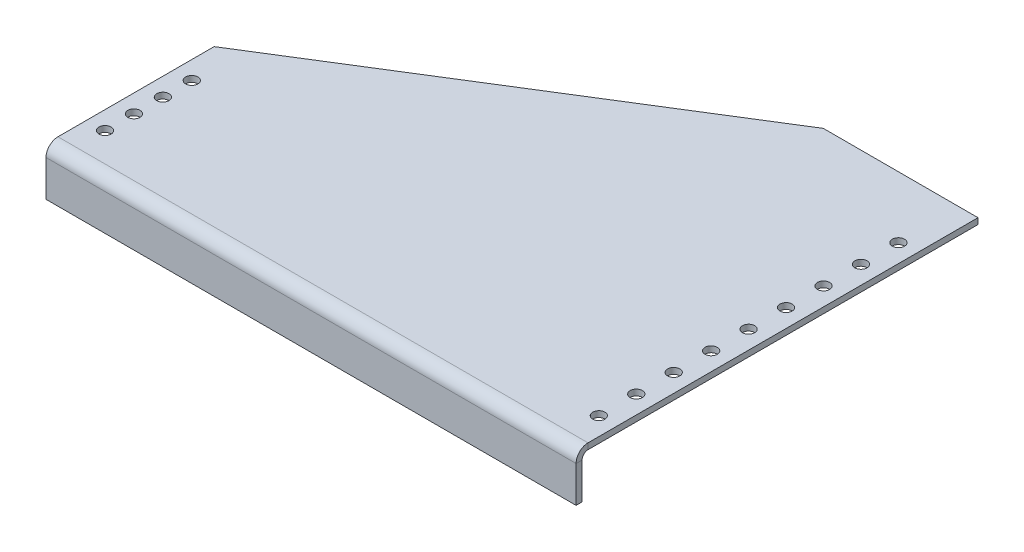
ISO-10303-21;
HEADER;
FILE_DESCRIPTION(('STEP AP214'),'2;1');
FILE_NAME('part.step','',(''),(''),'','','');
FILE_SCHEMA(('AUTOMOTIVE_DESIGN { 1 0 10303 214 1 1 1 1 }'));
ENDSEC;
DATA;
#1=APPLICATION_CONTEXT('core data for automotive mechanical design processes');
#2=APPLICATION_PROTOCOL_DEFINITION('international standard','automotive_design',2000,#1);
#3=PRODUCT_CONTEXT('',#1,'mechanical');
#4=PRODUCT('Part','Part','',(#3));
#5=PRODUCT_RELATED_PRODUCT_CATEGORY('part','',(#4));
#6=PRODUCT_DEFINITION_FORMATION('','',#4);
#7=PRODUCT_DEFINITION_CONTEXT('part definition',#1,'design');
#8=PRODUCT_DEFINITION('design','',#6,#7);
#9=PRODUCT_DEFINITION_SHAPE('','',#8);
#10=(LENGTH_UNIT() NAMED_UNIT(*) SI_UNIT(.MILLI.,.METRE.));
#11=(NAMED_UNIT(*) PLANE_ANGLE_UNIT() SI_UNIT($,.RADIAN.));
#12=(NAMED_UNIT(*) SI_UNIT($,.STERADIAN.) SOLID_ANGLE_UNIT());
#13=UNCERTAINTY_MEASURE_WITH_UNIT(LENGTH_MEASURE(1.E-05),#10,'distance_accuracy_value','');
#14=(GEOMETRIC_REPRESENTATION_CONTEXT(3) GLOBAL_UNCERTAINTY_ASSIGNED_CONTEXT((#13)) GLOBAL_UNIT_ASSIGNED_CONTEXT((#10,
#11,#12)) REPRESENTATION_CONTEXT('',''));
#15=CARTESIAN_POINT('',(0.,0.,0.));
#16=DIRECTION('',(0.,0.,1.));
#17=DIRECTION('',(1.,0.,0.));
#18=AXIS2_PLACEMENT_3D('',#15,#16,#17);
#19=CARTESIAN_POINT('',(-89.3979999999895,-2.3622,87.757));
#20=DIRECTION('',(-1.,0.,0.));
#21=DIRECTION('',(0.,0.,1.));
#22=AXIS2_PLACEMENT_3D('',#19,#20,#21);
#23=PLANE('',#22);
#24=DIRECTION('',(0.,1.,0.));
#25=VECTOR('',#24,1.);
#26=CARTESIAN_POINT('',(-89.3979999999895,-2.3622,23.6781659251188));
#27=LINE('',#26,#25);
#28=CARTESIAN_POINT('',(-89.3979999999895,-2.3622,23.6781659251188));
#29=VERTEX_POINT('',#28);
#30=CARTESIAN_POINT('',(-89.3979999999895,0.,23.6781659251188));
#31=VERTEX_POINT('',#30);
#32=EDGE_CURVE('E118',#29,#31,#27,.T.);
#33=ORIENTED_EDGE('',*,*,#32,.F.);
#34=DIRECTION('',(0.,0.,1.));
#35=VECTOR('',#34,1.);
#36=CARTESIAN_POINT('',(-89.3979999999895,-2.3622,87.757));
#37=LINE('',#36,#35);
#38=CARTESIAN_POINT('',(-89.3979999999894,-2.36219999999999,85.397));
#39=VERTEX_POINT('',#38);
#40=EDGE_CURVE('E192',#29,#39,#37,.T.);
#41=ORIENTED_EDGE('',*,*,#40,.T.);
#42=DIRECTION('',(0.,1.,0.));
#43=VECTOR('',#42,1.);
#44=CARTESIAN_POINT('',(-89.3979999999894,-2.36219999999999,85.397));
#45=LINE('',#44,#43);
#46=CARTESIAN_POINT('',(-89.3979999999894,0.,85.397));
#47=VERTEX_POINT('',#46);
#48=EDGE_CURVE('E177',#39,#47,#45,.T.);
#49=ORIENTED_EDGE('',*,*,#48,.T.);
#50=DIRECTION('',(0.,0.,1.));
#51=VECTOR('',#50,1.);
#52=CARTESIAN_POINT('',(-89.3979999999895,0.,87.757));
#53=LINE('',#52,#51);
#54=EDGE_CURVE('E189',#31,#47,#53,.T.);
#55=ORIENTED_EDGE('',*,*,#54,.F.);
#56=EDGE_LOOP('',(#33,#41,#49,#55));
#57=FACE_BOUND('',#56,.T.);
#58=ADVANCED_FACE('F43',(#57),#23,.T.);
#59=CARTESIAN_POINT('',(0.,-2.3622,0.));
#60=DIRECTION('',(0.,1.,0.));
#61=DIRECTION('',(0.,0.,1.));
#62=AXIS2_PLACEMENT_3D('',#59,#60,#61);
#63=PLANE('',#62);
#64=CARTESIAN_POINT('',(112.914100000012,-2.3622,73.9669999999571));
#65=DIRECTION('',(0.,-1.,0.));
#66=DIRECTION('',(0.,0.,-1.));
#67=AXIS2_PLACEMENT_3D('',#64,#65,#66);
#68=CIRCLE('',#67,2.41299999999999);
#69=CARTESIAN_POINT('',(112.914100000012,-2.3622,71.5539999999571));
#70=VERTEX_POINT('',#69);
#71=EDGE_CURVE('E325',#70,#70,#68,.T.);
#72=ORIENTED_EDGE('',*,*,#71,.F.);
#73=EDGE_LOOP('',(#72));
#74=FACE_BOUND('',#73,.T.);
#75=CARTESIAN_POINT('',(112.914100000012,-2.3622,59.1689106376127));
#76=DIRECTION('',(0.,-1.,0.));
#77=DIRECTION('',(0.,0.,-1.));
#78=AXIS2_PLACEMENT_3D('',#75,#76,#77);
#79=CIRCLE('',#78,2.41300000000001);
#80=CARTESIAN_POINT('',(112.914100000012,-2.3622,56.7559106376127));
#81=VERTEX_POINT('',#80);
#82=EDGE_CURVE('E326',#81,#81,#79,.T.);
#83=ORIENTED_EDGE('',*,*,#82,.F.);
#84=EDGE_LOOP('',(#83));
#85=FACE_BOUND('',#84,.T.);
#86=CARTESIAN_POINT('',(112.914100000012,-2.3622,44.3708212752683));
#87=DIRECTION('',(0.,-1.,0.));
#88=DIRECTION('',(0.,0.,-1.));
#89=AXIS2_PLACEMENT_3D('',#86,#87,#88);
#90=CIRCLE('',#89,2.41299999999999);
#91=CARTESIAN_POINT('',(112.914100000012,-2.3622,41.9578212752683));
#92=VERTEX_POINT('',#91);
#93=EDGE_CURVE('E335',#92,#92,#90,.T.);
#94=ORIENTED_EDGE('',*,*,#93,.F.);
#95=EDGE_LOOP('',(#94));
#96=FACE_BOUND('',#95,.T.);
#97=CARTESIAN_POINT('',(112.914100000012,-2.3622,29.5727319129239));
#98=DIRECTION('',(0.,-1.,0.));
#99=DIRECTION('',(0.,0.,-1.));
#100=AXIS2_PLACEMENT_3D('',#97,#98,#99);
#101=CIRCLE('',#100,2.413);
#102=CARTESIAN_POINT('',(112.914100000012,-2.3622,27.1597319129239));
#103=VERTEX_POINT('',#102);
#104=EDGE_CURVE('E341',#103,#103,#101,.T.);
#105=ORIENTED_EDGE('',*,*,#104,.F.);
#106=EDGE_LOOP('',(#105));
#107=FACE_BOUND('',#106,.T.);
#108=CARTESIAN_POINT('',(112.914100000012,-2.3622,14.7746425505795));
#109=DIRECTION('',(0.,-1.,0.));
#110=DIRECTION('',(0.,0.,-1.));
#111=AXIS2_PLACEMENT_3D('',#108,#109,#110);
#112=CIRCLE('',#111,2.41300000000001);
#113=CARTESIAN_POINT('',(112.914100000012,-2.3622,12.3616425505795));
#114=VERTEX_POINT('',#113);
#115=EDGE_CURVE('E347',#114,#114,#112,.T.);
#116=ORIENTED_EDGE('',*,*,#115,.F.);
#117=EDGE_LOOP('',(#116));
#118=FACE_BOUND('',#117,.T.);
#119=CARTESIAN_POINT('',(112.914100000012,-2.3622,-0.023446811764952));
#120=DIRECTION('',(0.,-1.,0.));
#121=DIRECTION('',(0.,0.,-1.));
#122=AXIS2_PLACEMENT_3D('',#119,#120,#121);
#123=CIRCLE('',#122,2.41299999999999);
#124=CARTESIAN_POINT('',(112.914100000012,-2.3622,-2.43644681176495));
#125=VERTEX_POINT('',#124);
#126=EDGE_CURVE('E353',#125,#125,#123,.T.);
#127=ORIENTED_EDGE('',*,*,#126,.F.);
#128=EDGE_LOOP('',(#127));
#129=FACE_BOUND('',#128,.T.);
#130=CARTESIAN_POINT('',(112.914100000012,-2.3622,-14.8215361741094));
#131=DIRECTION('',(0.,-1.,0.));
#132=DIRECTION('',(0.,0.,-1.));
#133=AXIS2_PLACEMENT_3D('',#130,#131,#132);
#134=CIRCLE('',#133,2.41300000000001);
#135=CARTESIAN_POINT('',(112.914100000012,-2.3622,-17.2345361741094));
#136=VERTEX_POINT('',#135);
#137=EDGE_CURVE('E359',#136,#136,#134,.T.);
#138=ORIENTED_EDGE('',*,*,#137,.F.);
#139=EDGE_LOOP('',(#138));
#140=FACE_BOUND('',#139,.T.);
#141=CARTESIAN_POINT('',(112.914100000012,-2.3622,-29.6196255364538));
#142=DIRECTION('',(0.,-1.,0.));
#143=DIRECTION('',(0.,0.,-1.));
#144=AXIS2_PLACEMENT_3D('',#141,#142,#143);
#145=CIRCLE('',#144,2.413);
#146=CARTESIAN_POINT('',(112.914100000012,-2.3622,-32.0326255364538));
#147=VERTEX_POINT('',#146);
#148=EDGE_CURVE('E365',#147,#147,#145,.T.);
#149=ORIENTED_EDGE('',*,*,#148,.F.);
#150=EDGE_LOOP('',(#149));
#151=FACE_BOUND('',#150,.T.);
#152=CARTESIAN_POINT('',(112.914100000012,-2.3622,-44.4177148987982));
#153=DIRECTION('',(0.,-1.,0.));
#154=DIRECTION('',(0.,0.,-1.));
#155=AXIS2_PLACEMENT_3D('',#152,#153,#154);
#156=CIRCLE('',#155,2.41299999999999);
#157=CARTESIAN_POINT('',(112.914100000012,-2.3622,-46.8307148987982));
#158=VERTEX_POINT('',#157);
#159=EDGE_CURVE('E371',#158,#158,#156,.T.);
#160=ORIENTED_EDGE('',*,*,#159,.F.);
#161=EDGE_LOOP('',(#160));
#162=FACE_BOUND('',#161,.T.);
#163=CARTESIAN_POINT('',(-82.2340999999855,-2.3622,73.9669999999578));
#164=DIRECTION('',(0.,-1.,0.));
#165=DIRECTION('',(0.,0.,-1.));
#166=AXIS2_PLACEMENT_3D('',#163,#164,#165);
#167=CIRCLE('',#166,2.41299999999999);
#168=CARTESIAN_POINT('',(-82.2340999999855,-2.3622,71.5539999999579));
#169=VERTEX_POINT('',#168);
#170=EDGE_CURVE('E379',#169,#169,#167,.T.);
#171=ORIENTED_EDGE('',*,*,#170,.F.);
#172=EDGE_LOOP('',(#171));
#173=FACE_BOUND('',#172,.T.);
#174=CARTESIAN_POINT('',(-82.2340999999855,-2.3622,62.5369999999578));
#175=DIRECTION('',(0.,-1.,0.));
#176=DIRECTION('',(0.,0.,-1.));
#177=AXIS2_PLACEMENT_3D('',#174,#175,#176);
#178=CIRCLE('',#177,2.41299999999999);
#179=CARTESIAN_POINT('',(-82.2340999999855,-2.3622,60.1239999999579));
#180=VERTEX_POINT('',#179);
#181=EDGE_CURVE('E382',#180,#180,#178,.T.);
#182=ORIENTED_EDGE('',*,*,#181,.F.);
#183=EDGE_LOOP('',(#182));
#184=FACE_BOUND('',#183,.T.);
#185=CARTESIAN_POINT('',(-82.2340999999856,-2.3622,51.1069999999578));
#186=DIRECTION('',(0.,-1.,0.));
#187=DIRECTION('',(0.,0.,-1.));
#188=AXIS2_PLACEMENT_3D('',#185,#186,#187);
#189=CIRCLE('',#188,2.41300000000001);
#190=CARTESIAN_POINT('',(-82.2340999999856,-2.3622,48.6939999999578));
#191=VERTEX_POINT('',#190);
#192=EDGE_CURVE('E388',#191,#191,#189,.T.);
#193=ORIENTED_EDGE('',*,*,#192,.F.);
#194=EDGE_LOOP('',(#193));
#195=FACE_BOUND('',#194,.T.);
#196=CARTESIAN_POINT('',(-82.2340999999856,-2.3622,39.6769999999579));
#197=DIRECTION('',(0.,-1.,0.));
#198=DIRECTION('',(0.,0.,-1.));
#199=AXIS2_PLACEMENT_3D('',#196,#197,#198);
#200=CIRCLE('',#199,2.41299999999999);
#201=CARTESIAN_POINT('',(-82.2340999999856,-2.3622,37.2639999999579));
#202=VERTEX_POINT('',#201);
#203=EDGE_CURVE('E393',#202,#202,#200,.T.);
#204=ORIENTED_EDGE('',*,*,#203,.F.);
#205=EDGE_LOOP('',(#204));
#206=FACE_BOUND('',#205,.T.);
#207=ORIENTED_EDGE('',*,*,#40,.F.);
#208=DIRECTION('',(-0.848832674791451,0.,0.528661602735049));
#209=VECTOR('',#208,1.);
#210=CARTESIAN_POINT('',(-94.1201999999872,-2.3622,26.6192000000001));
#211=LINE('',#210,#209);
#212=CARTESIAN_POINT('',(58.9380000000124,-2.3622,-68.7070000000431));
#213=VERTEX_POINT('',#212);
#214=EDGE_CURVE('E132',#213,#29,#211,.T.);
#215=ORIENTED_EDGE('',*,*,#214,.F.);
#216=DIRECTION('',(-1.,0.,0.));
#217=VECTOR('',#216,1.);
#218=CARTESIAN_POINT('',(58.9380000000124,-2.3622,-68.7070000000431));
#219=LINE('',#218,#217);
#220=CARTESIAN_POINT('',(120.078000000012,-2.3622,-68.7070000000431));
#221=VERTEX_POINT('',#220);
#222=EDGE_CURVE('E115',#221,#213,#219,.T.);
#223=ORIENTED_EDGE('',*,*,#222,.F.);
#224=DIRECTION('',(0.,0.,-1.));
#225=VECTOR('',#224,1.);
#226=CARTESIAN_POINT('',(120.078000000012,-2.3622,87.757));
#227=LINE('',#226,#225);
#228=CARTESIAN_POINT('',(120.078000000012,-2.36219999999999,85.397));
#229=VERTEX_POINT('',#228);
#230=EDGE_CURVE('E50',#229,#221,#227,.T.);
#231=ORIENTED_EDGE('',*,*,#230,.F.);
#232=DIRECTION('',(-1.,0.,0.));
#233=VECTOR('',#232,1.);
#234=CARTESIAN_POINT('',(-89.3979999999894,-2.36219999999999,85.397));
#235=LINE('',#234,#233);
#236=EDGE_CURVE('E183',#39,#229,#235,.F.);
#237=ORIENTED_EDGE('',*,*,#236,.F.);
#238=EDGE_LOOP('',(#207,#215,#223,#231,#237));
#239=FACE_BOUND('',#238,.T.);
#240=ADVANCED_FACE('F207',(#74,#85,#96,#107,#118,#129,#140,#151,#162,#173,#184,#195,#206,#239),
#63,.F.);
#241=CARTESIAN_POINT('',(0.,0.,0.));
#242=DIRECTION('',(0.,1.,0.));
#243=DIRECTION('',(0.,0.,1.));
#244=AXIS2_PLACEMENT_3D('',#241,#242,#243);
#245=PLANE('',#244);
#246=CARTESIAN_POINT('',(112.914100000012,0.,73.9669999999571));
#247=DIRECTION('',(0.,-1.,0.));
#248=DIRECTION('',(0.,0.,-1.));
#249=AXIS2_PLACEMENT_3D('',#246,#247,#248);
#250=CIRCLE('',#249,2.41299999999999);
#251=CARTESIAN_POINT('',(112.914100000012,0.,71.5539999999571));
#252=VERTEX_POINT('',#251);
#253=EDGE_CURVE('E323',#252,#252,#250,.T.);
#254=ORIENTED_EDGE('',*,*,#253,.T.);
#255=EDGE_LOOP('',(#254));
#256=FACE_BOUND('',#255,.T.);
#257=CARTESIAN_POINT('',(112.914100000012,0.,59.1689106376127));
#258=DIRECTION('',(0.,-1.,0.));
#259=DIRECTION('',(0.,0.,-1.));
#260=AXIS2_PLACEMENT_3D('',#257,#258,#259);
#261=CIRCLE('',#260,2.41300000000001);
#262=CARTESIAN_POINT('',(112.914100000012,0.,56.7559106376127));
#263=VERTEX_POINT('',#262);
#264=EDGE_CURVE('E330',#263,#263,#261,.T.);
#265=ORIENTED_EDGE('',*,*,#264,.T.);
#266=EDGE_LOOP('',(#265));
#267=FACE_BOUND('',#266,.T.);
#268=CARTESIAN_POINT('',(112.914100000012,0.,44.3708212752683));
#269=DIRECTION('',(0.,-1.,0.));
#270=DIRECTION('',(0.,0.,-1.));
#271=AXIS2_PLACEMENT_3D('',#268,#269,#270);
#272=CIRCLE('',#271,2.41299999999999);
#273=CARTESIAN_POINT('',(112.914100000012,0.,41.9578212752683));
#274=VERTEX_POINT('',#273);
#275=EDGE_CURVE('E338',#274,#274,#272,.T.);
#276=ORIENTED_EDGE('',*,*,#275,.T.);
#277=EDGE_LOOP('',(#276));
#278=FACE_BOUND('',#277,.T.);
#279=CARTESIAN_POINT('',(112.914100000012,0.,29.5727319129239));
#280=DIRECTION('',(0.,-1.,0.));
#281=DIRECTION('',(0.,0.,-1.));
#282=AXIS2_PLACEMENT_3D('',#279,#280,#281);
#283=CIRCLE('',#282,2.413);
#284=CARTESIAN_POINT('',(112.914100000012,0.,27.1597319129239));
#285=VERTEX_POINT('',#284);
#286=EDGE_CURVE('E344',#285,#285,#283,.T.);
#287=ORIENTED_EDGE('',*,*,#286,.T.);
#288=EDGE_LOOP('',(#287));
#289=FACE_BOUND('',#288,.T.);
#290=CARTESIAN_POINT('',(112.914100000012,0.,14.7746425505795));
#291=DIRECTION('',(0.,-1.,0.));
#292=DIRECTION('',(0.,0.,-1.));
#293=AXIS2_PLACEMENT_3D('',#290,#291,#292);
#294=CIRCLE('',#293,2.41300000000001);
#295=CARTESIAN_POINT('',(112.914100000012,0.,12.3616425505795));
#296=VERTEX_POINT('',#295);
#297=EDGE_CURVE('E350',#296,#296,#294,.T.);
#298=ORIENTED_EDGE('',*,*,#297,.T.);
#299=EDGE_LOOP('',(#298));
#300=FACE_BOUND('',#299,.T.);
#301=CARTESIAN_POINT('',(112.914100000012,0.,-0.023446811764952));
#302=DIRECTION('',(0.,-1.,0.));
#303=DIRECTION('',(0.,0.,-1.));
#304=AXIS2_PLACEMENT_3D('',#301,#302,#303);
#305=CIRCLE('',#304,2.41299999999999);
#306=CARTESIAN_POINT('',(112.914100000012,0.,-2.43644681176495));
#307=VERTEX_POINT('',#306);
#308=EDGE_CURVE('E356',#307,#307,#305,.T.);
#309=ORIENTED_EDGE('',*,*,#308,.T.);
#310=EDGE_LOOP('',(#309));
#311=FACE_BOUND('',#310,.T.);
#312=CARTESIAN_POINT('',(112.914100000012,0.,-14.8215361741094));
#313=DIRECTION('',(0.,-1.,0.));
#314=DIRECTION('',(0.,0.,-1.));
#315=AXIS2_PLACEMENT_3D('',#312,#313,#314);
#316=CIRCLE('',#315,2.41300000000001);
#317=CARTESIAN_POINT('',(112.914100000012,0.,-17.2345361741094));
#318=VERTEX_POINT('',#317);
#319=EDGE_CURVE('E362',#318,#318,#316,.T.);
#320=ORIENTED_EDGE('',*,*,#319,.T.);
#321=EDGE_LOOP('',(#320));
#322=FACE_BOUND('',#321,.T.);
#323=CARTESIAN_POINT('',(112.914100000012,0.,-29.6196255364538));
#324=DIRECTION('',(0.,-1.,0.));
#325=DIRECTION('',(0.,0.,-1.));
#326=AXIS2_PLACEMENT_3D('',#323,#324,#325);
#327=CIRCLE('',#326,2.413);
#328=CARTESIAN_POINT('',(112.914100000012,0.,-32.0326255364538));
#329=VERTEX_POINT('',#328);
#330=EDGE_CURVE('E368',#329,#329,#327,.T.);
#331=ORIENTED_EDGE('',*,*,#330,.T.);
#332=EDGE_LOOP('',(#331));
#333=FACE_BOUND('',#332,.T.);
#334=CARTESIAN_POINT('',(112.914100000012,0.,-44.4177148987982));
#335=DIRECTION('',(0.,-1.,0.));
#336=DIRECTION('',(0.,0.,-1.));
#337=AXIS2_PLACEMENT_3D('',#334,#335,#336);
#338=CIRCLE('',#337,2.41299999999999);
#339=CARTESIAN_POINT('',(112.914100000012,0.,-46.8307148987982));
#340=VERTEX_POINT('',#339);
#341=EDGE_CURVE('E374',#340,#340,#338,.T.);
#342=ORIENTED_EDGE('',*,*,#341,.T.);
#343=EDGE_LOOP('',(#342));
#344=FACE_BOUND('',#343,.T.);
#345=CARTESIAN_POINT('',(-82.2340999999855,0.,73.9669999999578));
#346=DIRECTION('',(0.,-1.,0.));
#347=DIRECTION('',(0.,0.,-1.));
#348=AXIS2_PLACEMENT_3D('',#345,#346,#347);
#349=CIRCLE('',#348,2.41299999999999);
#350=CARTESIAN_POINT('',(-82.2340999999855,0.,71.5539999999579));
#351=VERTEX_POINT('',#350);
#352=EDGE_CURVE('E139',#351,#351,#349,.T.);
#353=ORIENTED_EDGE('',*,*,#352,.T.);
#354=EDGE_LOOP('',(#353));
#355=FACE_BOUND('',#354,.T.);
#356=CARTESIAN_POINT('',(-82.2340999999855,0.,62.5369999999578));
#357=DIRECTION('',(0.,-1.,0.));
#358=DIRECTION('',(0.,0.,-1.));
#359=AXIS2_PLACEMENT_3D('',#356,#357,#358);
#360=CIRCLE('',#359,2.41299999999999);
#361=CARTESIAN_POINT('',(-82.2340999999855,0.,60.1239999999579));
#362=VERTEX_POINT('',#361);
#363=EDGE_CURVE('E385',#362,#362,#360,.T.);
#364=ORIENTED_EDGE('',*,*,#363,.T.);
#365=EDGE_LOOP('',(#364));
#366=FACE_BOUND('',#365,.T.);
#367=CARTESIAN_POINT('',(-82.2340999999856,0.,51.1069999999578));
#368=DIRECTION('',(0.,-1.,0.));
#369=DIRECTION('',(0.,0.,-1.));
#370=AXIS2_PLACEMENT_3D('',#367,#368,#369);
#371=CIRCLE('',#370,2.41300000000001);
#372=CARTESIAN_POINT('',(-82.2340999999856,0.,48.6939999999578));
#373=VERTEX_POINT('',#372);
#374=EDGE_CURVE('E391',#373,#373,#371,.T.);
#375=ORIENTED_EDGE('',*,*,#374,.T.);
#376=EDGE_LOOP('',(#375));
#377=FACE_BOUND('',#376,.T.);
#378=CARTESIAN_POINT('',(-82.2340999999856,0.,39.6769999999579));
#379=DIRECTION('',(0.,-1.,0.));
#380=DIRECTION('',(0.,0.,-1.));
#381=AXIS2_PLACEMENT_3D('',#378,#379,#380);
#382=CIRCLE('',#381,2.41299999999999);
#383=CARTESIAN_POINT('',(-82.2340999999856,0.,37.2639999999579));
#384=VERTEX_POINT('',#383);
#385=EDGE_CURVE('E136',#384,#384,#382,.T.);
#386=ORIENTED_EDGE('',*,*,#385,.T.);
#387=EDGE_LOOP('',(#386));
#388=FACE_BOUND('',#387,.T.);
#389=DIRECTION('',(-0.848832674791451,0.,0.528661602735049));
#390=VECTOR('',#389,1.);
#391=CARTESIAN_POINT('',(-94.1201999999872,0.,26.6192000000001));
#392=LINE('',#391,#390);
#393=CARTESIAN_POINT('',(58.9380000000124,0.,-68.7070000000431));
#394=VERTEX_POINT('',#393);
#395=EDGE_CURVE('E119',#394,#31,#392,.T.);
#396=ORIENTED_EDGE('',*,*,#395,.T.);
#397=ORIENTED_EDGE('',*,*,#54,.T.);
#398=DIRECTION('',(-1.,0.,0.));
#399=VECTOR('',#398,1.);
#400=CARTESIAN_POINT('',(-89.3979999999894,0.,85.397));
#401=LINE('',#400,#399);
#402=CARTESIAN_POINT('',(120.078000000012,0.,85.397));
#403=VERTEX_POINT('',#402);
#404=EDGE_CURVE('E173',#47,#403,#401,.F.);
#405=ORIENTED_EDGE('',*,*,#404,.T.);
#406=DIRECTION('',(0.,0.,-1.));
#407=VECTOR('',#406,1.);
#408=CARTESIAN_POINT('',(120.078000000012,0.,87.757));
#409=LINE('',#408,#407);
#410=CARTESIAN_POINT('',(120.078000000012,0.,-68.7070000000431));
#411=VERTEX_POINT('',#410);
#412=EDGE_CURVE('E131',#403,#411,#409,.T.);
#413=ORIENTED_EDGE('',*,*,#412,.T.);
#414=DIRECTION('',(-1.,0.,0.));
#415=VECTOR('',#414,1.);
#416=CARTESIAN_POINT('',(58.9380000000124,0.,-68.7070000000431));
#417=LINE('',#416,#415);
#418=EDGE_CURVE('E56',#411,#394,#417,.T.);
#419=ORIENTED_EDGE('',*,*,#418,.T.);
#420=EDGE_LOOP('',(#396,#397,#405,#413,#419));
#421=FACE_BOUND('',#420,.T.);
#422=ADVANCED_FACE('F128',(#256,#267,#278,#289,#300,#311,#322,#333,#344,#355,#366,#377,#388,
#421),#245,.T.);
#423=CARTESIAN_POINT('',(120.078000000012,-2.3622,87.757));
#424=DIRECTION('',(1.,0.,0.));
#425=DIRECTION('',(0.,0.,-1.));
#426=AXIS2_PLACEMENT_3D('',#423,#424,#425);
#427=PLANE('',#426);
#428=DIRECTION('',(0.,-1.,0.));
#429=VECTOR('',#428,1.);
#430=CARTESIAN_POINT('',(120.078000000012,-2.3622,-68.7070000000431));
#431=LINE('',#430,#429);
#432=EDGE_CURVE('E11',#411,#221,#431,.T.);
#433=ORIENTED_EDGE('',*,*,#432,.F.);
#434=ORIENTED_EDGE('',*,*,#412,.F.);
#435=DIRECTION('',(0.,1.,0.));
#436=VECTOR('',#435,1.);
#437=CARTESIAN_POINT('',(120.078000000012,-2.36219999999999,85.397));
#438=LINE('',#437,#436);
#439=EDGE_CURVE('E187',#229,#403,#438,.T.);
#440=ORIENTED_EDGE('',*,*,#439,.F.);
#441=ORIENTED_EDGE('',*,*,#230,.T.);
#442=EDGE_LOOP('',(#433,#434,#440,#441));
#443=FACE_BOUND('',#442,.T.);
#444=ADVANCED_FACE('F217',(#443),#427,.T.);
#445=CARTESIAN_POINT('',(120.078000000012,-4.72219999999998,85.397));
#446=DIRECTION('',(1.,0.,0.));
#447=DIRECTION('',(0.,0.,-1.));
#448=AXIS2_PLACEMENT_3D('',#445,#446,#447);
#449=PLANE('',#448);
#450=DIRECTION('',(0.,0.,1.));
#451=VECTOR('',#450,1.);
#452=CARTESIAN_POINT('',(120.078000000012,-4.72219999999998,87.757));
#453=LINE('',#452,#451);
#454=CARTESIAN_POINT('',(120.078000000012,-4.72219999999997,87.757));
#455=VERTEX_POINT('',#454);
#456=CARTESIAN_POINT('',(120.078000000012,-4.72219999999997,90.1192));
#457=VERTEX_POINT('',#456);
#458=EDGE_CURVE('E142',#455,#457,#453,.T.);
#459=ORIENTED_EDGE('',*,*,#458,.F.);
#460=CARTESIAN_POINT('',(120.078000000012,-4.72219999999998,85.397));
#461=DIRECTION('',(-1.,0.,0.));
#462=DIRECTION('',(0.,0.,1.));
#463=AXIS2_PLACEMENT_3D('',#460,#461,#462);
#464=CIRCLE('',#463,2.35999999999999);
#465=EDGE_CURVE('E180',#229,#455,#464,.F.);
#466=ORIENTED_EDGE('',*,*,#465,.F.);
#467=ORIENTED_EDGE('',*,*,#439,.T.);
#468=CARTESIAN_POINT('',(120.078000000012,-4.72219999999998,85.397));
#469=DIRECTION('',(-1.,0.,0.));
#470=DIRECTION('',(0.,0.,1.));
#471=AXIS2_PLACEMENT_3D('',#468,#469,#470);
#472=CIRCLE('',#471,4.72219999999999);
#473=EDGE_CURVE('E64',#403,#457,#472,.F.);
#474=ORIENTED_EDGE('',*,*,#473,.T.);
#475=EDGE_LOOP('',(#459,#466,#467,#474));
#476=FACE_BOUND('',#475,.T.);
#477=ADVANCED_FACE('F215',(#476),#449,.T.);
#478=CARTESIAN_POINT('',(-89.3979999999894,-4.72219999999998,85.397));
#479=DIRECTION('',(1.,0.,0.));
#480=DIRECTION('',(0.,0.,-1.));
#481=AXIS2_PLACEMENT_3D('',#478,#479,#480);
#482=PLANE('',#481);
#483=CARTESIAN_POINT('',(-89.3979999999894,-4.72219999999998,85.397));
#484=DIRECTION('',(-1.,0.,0.));
#485=DIRECTION('',(0.,0.,1.));
#486=AXIS2_PLACEMENT_3D('',#483,#484,#485);
#487=CIRCLE('',#486,2.35999999999999);
#488=CARTESIAN_POINT('',(-89.3979999999894,-4.72219999999997,87.757));
#489=VERTEX_POINT('',#488);
#490=EDGE_CURVE('E172',#489,#39,#487,.T.);
#491=ORIENTED_EDGE('',*,*,#490,.F.);
#492=DIRECTION('',(0.,0.,1.));
#493=VECTOR('',#492,1.);
#494=CARTESIAN_POINT('',(-89.3979999999894,-4.72219999999998,87.757));
#495=LINE('',#494,#493);
#496=CARTESIAN_POINT('',(-89.3979999999894,-4.72219999999998,90.1192));
#497=VERTEX_POINT('',#496);
#498=EDGE_CURVE('E145',#489,#497,#495,.T.);
#499=ORIENTED_EDGE('',*,*,#498,.T.);
#500=CARTESIAN_POINT('',(-89.3979999999894,-4.72219999999998,85.397));
#501=DIRECTION('',(-1.,0.,0.));
#502=DIRECTION('',(0.,0.,1.));
#503=AXIS2_PLACEMENT_3D('',#500,#501,#502);
#504=CIRCLE('',#503,4.72219999999999);
#505=EDGE_CURVE('E175',#497,#47,#504,.T.);
#506=ORIENTED_EDGE('',*,*,#505,.T.);
#507=ORIENTED_EDGE('',*,*,#48,.F.);
#508=EDGE_LOOP('',(#491,#499,#506,#507));
#509=FACE_BOUND('',#508,.T.);
#510=ADVANCED_FACE('F201',(#509),#482,.F.);
#511=CARTESIAN_POINT('',(-89.3979999999894,-4.72219999999998,85.397));
#512=DIRECTION('',(-1.,0.,0.));
#513=DIRECTION('',(0.,0.,1.));
#514=AXIS2_PLACEMENT_3D('',#511,#512,#513);
#515=CYLINDRICAL_SURFACE('',#514,4.72219999999999);
#516=ORIENTED_EDGE('',*,*,#404,.F.);
#517=ORIENTED_EDGE('',*,*,#505,.F.);
#518=DIRECTION('',(1.,0.,0.));
#519=VECTOR('',#518,1.);
#520=CARTESIAN_POINT('',(0.,-4.72219999999998,90.1192));
#521=LINE('',#520,#519);
#522=EDGE_CURVE('E148',#497,#457,#521,.T.);
#523=ORIENTED_EDGE('',*,*,#522,.T.);
#524=ORIENTED_EDGE('',*,*,#473,.F.);
#525=EDGE_LOOP('',(#516,#517,#523,#524));
#526=FACE_BOUND('',#525,.T.);
#527=ADVANCED_FACE('F197',(#526),#515,.T.);
#528=CARTESIAN_POINT('',(-89.3979999999894,-4.72219999999998,85.397));
#529=DIRECTION('',(-1.,0.,0.));
#530=DIRECTION('',(0.,0.,1.));
#531=AXIS2_PLACEMENT_3D('',#528,#529,#530);
#532=CYLINDRICAL_SURFACE('',#531,2.35999999999999);
#533=ORIENTED_EDGE('',*,*,#236,.T.);
#534=ORIENTED_EDGE('',*,*,#465,.T.);
#535=DIRECTION('',(-1.,0.,0.));
#536=VECTOR('',#535,1.);
#537=CARTESIAN_POINT('',(120.078000000012,-4.72219999999998,87.757));
#538=LINE('',#537,#536);
#539=EDGE_CURVE('E143',#455,#489,#538,.T.);
#540=ORIENTED_EDGE('',*,*,#539,.T.);
#541=ORIENTED_EDGE('',*,*,#490,.T.);
#542=EDGE_LOOP('',(#533,#534,#540,#541));
#543=FACE_BOUND('',#542,.T.);
#544=ADVANCED_FACE('F211',(#543),#532,.F.);
#545=CARTESIAN_POINT('',(-89.3979999999895,-19.05,90.1192));
#546=DIRECTION('',(1.,0.,0.));
#547=DIRECTION('',(0.,1.,0.));
#548=AXIS2_PLACEMENT_3D('',#545,#546,#547);
#549=PLANE('',#548);
#550=ORIENTED_EDGE('',*,*,#498,.F.);
#551=DIRECTION('',(0.,-1.,0.));
#552=VECTOR('',#551,1.);
#553=CARTESIAN_POINT('',(-89.3979999999895,-19.05,87.7570000000001));
#554=LINE('',#553,#552);
#555=CARTESIAN_POINT('',(-89.3979999999895,-19.05,87.7570000000001));
#556=VERTEX_POINT('',#555);
#557=EDGE_CURVE('E152',#489,#556,#554,.T.);
#558=ORIENTED_EDGE('',*,*,#557,.T.);
#559=DIRECTION('',(0.,0.,-1.));
#560=VECTOR('',#559,1.);
#561=CARTESIAN_POINT('',(-89.3979999999895,-19.05,90.1192));
#562=LINE('',#561,#560);
#563=CARTESIAN_POINT('',(-89.3979999999895,-19.05,90.1192));
#564=VERTEX_POINT('',#563);
#565=EDGE_CURVE('E169',#564,#556,#562,.T.);
#566=ORIENTED_EDGE('',*,*,#565,.F.);
#567=DIRECTION('',(0.,-1.,0.));
#568=VECTOR('',#567,1.);
#569=CARTESIAN_POINT('',(-89.3979999999895,-19.05,90.1192));
#570=LINE('',#569,#568);
#571=EDGE_CURVE('E153',#497,#564,#570,.T.);
#572=ORIENTED_EDGE('',*,*,#571,.F.);
#573=EDGE_LOOP('',(#550,#558,#566,#572));
#574=FACE_BOUND('',#573,.T.);
#575=ADVANCED_FACE('F244',(#574),#549,.F.);
#576=CARTESIAN_POINT('',(120.078000000012,-2.36219999999999,90.1192));
#577=DIRECTION('',(-1.,0.,0.));
#578=DIRECTION('',(0.,0.,1.));
#579=AXIS2_PLACEMENT_3D('',#576,#577,#578);
#580=PLANE('',#579);
#581=ORIENTED_EDGE('',*,*,#458,.T.);
#582=DIRECTION('',(0.,1.,0.));
#583=VECTOR('',#582,1.);
#584=CARTESIAN_POINT('',(120.078000000012,-2.36219999999999,90.1192));
#585=LINE('',#584,#583);
#586=CARTESIAN_POINT('',(120.078000000012,-19.05,90.1192));
#587=VERTEX_POINT('',#586);
#588=EDGE_CURVE('E158',#587,#457,#585,.T.);
#589=ORIENTED_EDGE('',*,*,#588,.F.);
#590=DIRECTION('',(0.,0.,-1.));
#591=VECTOR('',#590,1.);
#592=CARTESIAN_POINT('',(120.078000000012,-19.05,90.1192));
#593=LINE('',#592,#591);
#594=CARTESIAN_POINT('',(120.078000000012,-19.05,87.757));
#595=VERTEX_POINT('',#594);
#596=EDGE_CURVE('E161',#587,#595,#593,.T.);
#597=ORIENTED_EDGE('',*,*,#596,.T.);
#598=DIRECTION('',(0.,1.,0.));
#599=VECTOR('',#598,1.);
#600=CARTESIAN_POINT('',(120.078000000012,-2.3622,87.757));
#601=LINE('',#600,#599);
#602=EDGE_CURVE('E156',#595,#455,#601,.T.);
#603=ORIENTED_EDGE('',*,*,#602,.T.);
#604=EDGE_LOOP('',(#581,#589,#597,#603));
#605=FACE_BOUND('',#604,.T.);
#606=ADVANCED_FACE('F249',(#605),#580,.F.);
#607=CARTESIAN_POINT('',(0.,3.00166949370816E-13,90.1192));
#608=DIRECTION('',(0.,0.,-1.));
#609=DIRECTION('',(0.,1.,0.));
#610=AXIS2_PLACEMENT_3D('',#607,#608,#609);
#611=PLANE('',#610);
#612=ORIENTED_EDGE('',*,*,#522,.F.);
#613=ORIENTED_EDGE('',*,*,#571,.T.);
#614=DIRECTION('',(1.,0.,0.));
#615=VECTOR('',#614,1.);
#616=CARTESIAN_POINT('',(120.078000000012,-19.05,90.1192));
#617=LINE('',#616,#615);
#618=EDGE_CURVE('E155',#564,#587,#617,.T.);
#619=ORIENTED_EDGE('',*,*,#618,.T.);
#620=ORIENTED_EDGE('',*,*,#588,.T.);
#621=EDGE_LOOP('',(#612,#613,#619,#620));
#622=FACE_BOUND('',#621,.T.);
#623=ADVANCED_FACE('F257',(#622),#611,.F.);
#624=CARTESIAN_POINT('',(0.,2.919193721522E-13,87.757));
#625=DIRECTION('',(0.,0.,-1.));
#626=DIRECTION('',(0.,1.,0.));
#627=AXIS2_PLACEMENT_3D('',#624,#625,#626);
#628=PLANE('',#627);
#629=ORIENTED_EDGE('',*,*,#557,.F.);
#630=ORIENTED_EDGE('',*,*,#539,.F.);
#631=ORIENTED_EDGE('',*,*,#602,.F.);
#632=DIRECTION('',(1.,0.,0.));
#633=VECTOR('',#632,1.);
#634=CARTESIAN_POINT('',(120.078000000012,-19.05,87.757));
#635=LINE('',#634,#633);
#636=EDGE_CURVE('E163',#556,#595,#635,.T.);
#637=ORIENTED_EDGE('',*,*,#636,.F.);
#638=EDGE_LOOP('',(#629,#630,#631,#637));
#639=FACE_BOUND('',#638,.T.);
#640=ADVANCED_FACE('F253',(#639),#628,.T.);
#641=CARTESIAN_POINT('',(120.078000000012,-19.05,90.1192));
#642=DIRECTION('',(0.,1.,0.));
#643=DIRECTION('',(0.,0.,1.));
#644=AXIS2_PLACEMENT_3D('',#641,#642,#643);
#645=PLANE('',#644);
#646=ORIENTED_EDGE('',*,*,#636,.T.);
#647=ORIENTED_EDGE('',*,*,#596,.F.);
#648=ORIENTED_EDGE('',*,*,#618,.F.);
#649=ORIENTED_EDGE('',*,*,#565,.T.);
#650=EDGE_LOOP('',(#646,#647,#648,#649));
#651=FACE_BOUND('',#650,.T.);
#652=ADVANCED_FACE('F251',(#651),#645,.F.);
#653=CARTESIAN_POINT('',(-94.1201999999872,0.,26.6192000000001));
#654=DIRECTION('',(0.528661602735049,0.,0.848832674791451));
#655=DIRECTION('',(0.848832674791451,0.,-0.528661602735049));
#656=AXIS2_PLACEMENT_3D('',#653,#654,#655);
#657=PLANE('',#656);
#658=ORIENTED_EDGE('',*,*,#32,.T.);
#659=ORIENTED_EDGE('',*,*,#395,.F.);
#660=DIRECTION('',(0.,-1.,0.));
#661=VECTOR('',#660,1.);
#662=CARTESIAN_POINT('',(58.9380000000124,0.,-68.7070000000431));
#663=LINE('',#662,#661);
#664=EDGE_CURVE('E111',#394,#213,#663,.T.);
#665=ORIENTED_EDGE('',*,*,#664,.T.);
#666=ORIENTED_EDGE('',*,*,#214,.T.);
#667=EDGE_LOOP('',(#658,#659,#665,#666));
#668=FACE_BOUND('',#667,.T.);
#669=ADVANCED_FACE('F122',(#668),#657,.F.);
#670=CARTESIAN_POINT('',(58.9380000000124,0.,-68.7070000000431));
#671=DIRECTION('',(0.,0.,1.));
#672=DIRECTION('',(1.,0.,0.));
#673=AXIS2_PLACEMENT_3D('',#670,#671,#672);
#674=PLANE('',#673);
#675=ORIENTED_EDGE('',*,*,#432,.T.);
#676=ORIENTED_EDGE('',*,*,#222,.T.);
#677=ORIENTED_EDGE('',*,*,#664,.F.);
#678=ORIENTED_EDGE('',*,*,#418,.F.);
#679=EDGE_LOOP('',(#675,#676,#677,#678));
#680=FACE_BOUND('',#679,.T.);
#681=ADVANCED_FACE('F113',(#680),#674,.F.);
#682=CARTESIAN_POINT('',(-82.2340999999856,0.,39.6769999999579));
#683=DIRECTION('',(0.,-1.,0.));
#684=DIRECTION('',(0.,0.,-1.));
#685=AXIS2_PLACEMENT_3D('',#682,#683,#684);
#686=CYLINDRICAL_SURFACE('',#685,2.41299999999999);
#687=ORIENTED_EDGE('',*,*,#385,.F.);
#688=EDGE_LOOP('',(#687));
#689=FACE_BOUND('',#688,.T.);
#690=ORIENTED_EDGE('',*,*,#203,.T.);
#691=EDGE_LOOP('',(#690));
#692=FACE_BOUND('',#691,.T.);
#693=ADVANCED_FACE('F267',(#689,#692),#686,.F.);
#694=CARTESIAN_POINT('',(-82.2340999999856,0.,51.1069999999578));
#695=DIRECTION('',(0.,-1.,0.));
#696=DIRECTION('',(0.,0.,-1.));
#697=AXIS2_PLACEMENT_3D('',#694,#695,#696);
#698=CYLINDRICAL_SURFACE('',#697,2.41300000000001);
#699=ORIENTED_EDGE('',*,*,#374,.F.);
#700=EDGE_LOOP('',(#699));
#701=FACE_BOUND('',#700,.T.);
#702=ORIENTED_EDGE('',*,*,#192,.T.);
#703=EDGE_LOOP('',(#702));
#704=FACE_BOUND('',#703,.T.);
#705=ADVANCED_FACE('F271',(#701,#704),#698,.F.);
#706=CARTESIAN_POINT('',(-82.2340999999855,0.,62.5369999999578));
#707=DIRECTION('',(0.,-1.,0.));
#708=DIRECTION('',(0.,0.,-1.));
#709=AXIS2_PLACEMENT_3D('',#706,#707,#708);
#710=CYLINDRICAL_SURFACE('',#709,2.41299999999999);
#711=ORIENTED_EDGE('',*,*,#363,.F.);
#712=EDGE_LOOP('',(#711));
#713=FACE_BOUND('',#712,.T.);
#714=ORIENTED_EDGE('',*,*,#181,.T.);
#715=EDGE_LOOP('',(#714));
#716=FACE_BOUND('',#715,.T.);
#717=ADVANCED_FACE('F275',(#713,#716),#710,.F.);
#718=CARTESIAN_POINT('',(-82.2340999999855,0.,73.9669999999578));
#719=DIRECTION('',(0.,-1.,0.));
#720=DIRECTION('',(0.,0.,-1.));
#721=AXIS2_PLACEMENT_3D('',#718,#719,#720);
#722=CYLINDRICAL_SURFACE('',#721,2.41299999999999);
#723=ORIENTED_EDGE('',*,*,#352,.F.);
#724=EDGE_LOOP('',(#723));
#725=FACE_BOUND('',#724,.T.);
#726=ORIENTED_EDGE('',*,*,#170,.T.);
#727=EDGE_LOOP('',(#726));
#728=FACE_BOUND('',#727,.T.);
#729=ADVANCED_FACE('F279',(#725,#728),#722,.F.);
#730=CARTESIAN_POINT('',(112.914100000012,0.,-44.4177148987982));
#731=DIRECTION('',(0.,-1.,0.));
#732=DIRECTION('',(0.,0.,-1.));
#733=AXIS2_PLACEMENT_3D('',#730,#731,#732);
#734=CYLINDRICAL_SURFACE('',#733,2.41299999999999);
#735=ORIENTED_EDGE('',*,*,#341,.F.);
#736=EDGE_LOOP('',(#735));
#737=FACE_BOUND('',#736,.T.);
#738=ORIENTED_EDGE('',*,*,#159,.T.);
#739=EDGE_LOOP('',(#738));
#740=FACE_BOUND('',#739,.T.);
#741=ADVANCED_FACE('F282',(#737,#740),#734,.F.);
#742=CARTESIAN_POINT('',(112.914100000012,0.,-29.6196255364538));
#743=DIRECTION('',(0.,-1.,0.));
#744=DIRECTION('',(0.,0.,-1.));
#745=AXIS2_PLACEMENT_3D('',#742,#743,#744);
#746=CYLINDRICAL_SURFACE('',#745,2.413);
#747=ORIENTED_EDGE('',*,*,#330,.F.);
#748=EDGE_LOOP('',(#747));
#749=FACE_BOUND('',#748,.T.);
#750=ORIENTED_EDGE('',*,*,#148,.T.);
#751=EDGE_LOOP('',(#750));
#752=FACE_BOUND('',#751,.T.);
#753=ADVANCED_FACE('F286',(#749,#752),#746,.F.);
#754=CARTESIAN_POINT('',(112.914100000012,0.,-14.8215361741094));
#755=DIRECTION('',(0.,-1.,0.));
#756=DIRECTION('',(0.,0.,-1.));
#757=AXIS2_PLACEMENT_3D('',#754,#755,#756);
#758=CYLINDRICAL_SURFACE('',#757,2.41300000000001);
#759=ORIENTED_EDGE('',*,*,#319,.F.);
#760=EDGE_LOOP('',(#759));
#761=FACE_BOUND('',#760,.T.);
#762=ORIENTED_EDGE('',*,*,#137,.T.);
#763=EDGE_LOOP('',(#762));
#764=FACE_BOUND('',#763,.T.);
#765=ADVANCED_FACE('F290',(#761,#764),#758,.F.);
#766=CARTESIAN_POINT('',(112.914100000012,0.,-0.023446811764952));
#767=DIRECTION('',(0.,-1.,0.));
#768=DIRECTION('',(0.,0.,-1.));
#769=AXIS2_PLACEMENT_3D('',#766,#767,#768);
#770=CYLINDRICAL_SURFACE('',#769,2.41299999999999);
#771=ORIENTED_EDGE('',*,*,#308,.F.);
#772=EDGE_LOOP('',(#771));
#773=FACE_BOUND('',#772,.T.);
#774=ORIENTED_EDGE('',*,*,#126,.T.);
#775=EDGE_LOOP('',(#774));
#776=FACE_BOUND('',#775,.T.);
#777=ADVANCED_FACE('F294',(#773,#776),#770,.F.);
#778=CARTESIAN_POINT('',(112.914100000012,0.,14.7746425505795));
#779=DIRECTION('',(0.,-1.,0.));
#780=DIRECTION('',(0.,0.,-1.));
#781=AXIS2_PLACEMENT_3D('',#778,#779,#780);
#782=CYLINDRICAL_SURFACE('',#781,2.41300000000001);
#783=ORIENTED_EDGE('',*,*,#297,.F.);
#784=EDGE_LOOP('',(#783));
#785=FACE_BOUND('',#784,.T.);
#786=ORIENTED_EDGE('',*,*,#115,.T.);
#787=EDGE_LOOP('',(#786));
#788=FACE_BOUND('',#787,.T.);
#789=ADVANCED_FACE('F298',(#785,#788),#782,.F.);
#790=CARTESIAN_POINT('',(112.914100000012,0.,29.5727319129239));
#791=DIRECTION('',(0.,-1.,0.));
#792=DIRECTION('',(0.,0.,-1.));
#793=AXIS2_PLACEMENT_3D('',#790,#791,#792);
#794=CYLINDRICAL_SURFACE('',#793,2.413);
#795=ORIENTED_EDGE('',*,*,#286,.F.);
#796=EDGE_LOOP('',(#795));
#797=FACE_BOUND('',#796,.T.);
#798=ORIENTED_EDGE('',*,*,#104,.T.);
#799=EDGE_LOOP('',(#798));
#800=FACE_BOUND('',#799,.T.);
#801=ADVANCED_FACE('F302',(#797,#800),#794,.F.);
#802=CARTESIAN_POINT('',(112.914100000012,0.,44.3708212752683));
#803=DIRECTION('',(0.,-1.,0.));
#804=DIRECTION('',(0.,0.,-1.));
#805=AXIS2_PLACEMENT_3D('',#802,#803,#804);
#806=CYLINDRICAL_SURFACE('',#805,2.41299999999999);
#807=ORIENTED_EDGE('',*,*,#275,.F.);
#808=EDGE_LOOP('',(#807));
#809=FACE_BOUND('',#808,.T.);
#810=ORIENTED_EDGE('',*,*,#93,.T.);
#811=EDGE_LOOP('',(#810));
#812=FACE_BOUND('',#811,.T.);
#813=ADVANCED_FACE('F306',(#809,#812),#806,.F.);
#814=CARTESIAN_POINT('',(112.914100000012,0.,59.1689106376127));
#815=DIRECTION('',(0.,-1.,0.));
#816=DIRECTION('',(0.,0.,-1.));
#817=AXIS2_PLACEMENT_3D('',#814,#815,#816);
#818=CYLINDRICAL_SURFACE('',#817,2.41300000000001);
#819=ORIENTED_EDGE('',*,*,#264,.F.);
#820=EDGE_LOOP('',(#819));
#821=FACE_BOUND('',#820,.T.);
#822=ORIENTED_EDGE('',*,*,#82,.T.);
#823=EDGE_LOOP('',(#822));
#824=FACE_BOUND('',#823,.T.);
#825=ADVANCED_FACE('F310',(#821,#824),#818,.F.);
#826=CARTESIAN_POINT('',(112.914100000012,0.,73.9669999999571));
#827=DIRECTION('',(0.,-1.,0.));
#828=DIRECTION('',(0.,0.,-1.));
#829=AXIS2_PLACEMENT_3D('',#826,#827,#828);
#830=CYLINDRICAL_SURFACE('',#829,2.41299999999999);
#831=ORIENTED_EDGE('',*,*,#253,.F.);
#832=EDGE_LOOP('',(#831));
#833=FACE_BOUND('',#832,.T.);
#834=ORIENTED_EDGE('',*,*,#71,.T.);
#835=EDGE_LOOP('',(#834));
#836=FACE_BOUND('',#835,.T.);
#837=ADVANCED_FACE('F314',(#833,#836),#830,.F.);
#838=CLOSED_SHELL('',(#58,#240,#422,#444,#477,#510,#527,#544,#575,#606,#623,#640,#652,#669,#681,
#693,#705,#717,#729,#741,#753,#765,#777,#789,#801,#813,#825,#837));
#839=MANIFOLD_SOLID_BREP('B2',#838);
#840=ADVANCED_BREP_SHAPE_REPRESENTATION('',(#18,#839),#14);
#841=SHAPE_DEFINITION_REPRESENTATION(#9,#840);
ENDSEC;
END-ISO-10303-21;
